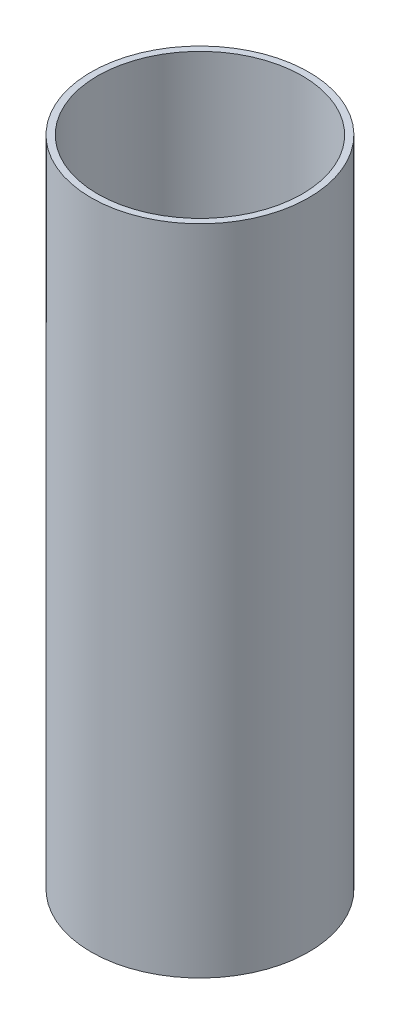
ISO-10303-21;
HEADER;
FILE_DESCRIPTION(('STEP AP214'),'2;1');
FILE_NAME('part.step','',(''),(''),'','','');
FILE_SCHEMA(('AUTOMOTIVE_DESIGN { 1 0 10303 214 1 1 1 1 }'));
ENDSEC;
DATA;
#1=APPLICATION_CONTEXT('core data for automotive mechanical design processes');
#2=APPLICATION_PROTOCOL_DEFINITION('international standard','automotive_design',2000,#1);
#3=PRODUCT_CONTEXT('',#1,'mechanical');
#4=PRODUCT('Part','Part','',(#3));
#5=PRODUCT_RELATED_PRODUCT_CATEGORY('part','',(#4));
#6=PRODUCT_DEFINITION_FORMATION('','',#4);
#7=PRODUCT_DEFINITION_CONTEXT('part definition',#1,'design');
#8=PRODUCT_DEFINITION('design','',#6,#7);
#9=PRODUCT_DEFINITION_SHAPE('','',#8);
#10=(LENGTH_UNIT() NAMED_UNIT(*) SI_UNIT(.MILLI.,.METRE.));
#11=(NAMED_UNIT(*) PLANE_ANGLE_UNIT() SI_UNIT($,.RADIAN.));
#12=(NAMED_UNIT(*) SI_UNIT($,.STERADIAN.) SOLID_ANGLE_UNIT());
#13=UNCERTAINTY_MEASURE_WITH_UNIT(LENGTH_MEASURE(1.E-05),#10,'distance_accuracy_value','');
#14=(GEOMETRIC_REPRESENTATION_CONTEXT(3) GLOBAL_UNCERTAINTY_ASSIGNED_CONTEXT((#13)) GLOBAL_UNIT_ASSIGNED_CONTEXT((#10,
#11,#12)) REPRESENTATION_CONTEXT('',''));
#15=CARTESIAN_POINT('',(0.,0.,0.));
#16=DIRECTION('',(0.,0.,1.));
#17=DIRECTION('',(1.,0.,0.));
#18=AXIS2_PLACEMENT_3D('',#15,#16,#17);
#19=CARTESIAN_POINT('',(0.,300.,0.));
#20=DIRECTION('',(0.,1.,0.));
#21=DIRECTION('',(0.,0.,1.));
#22=AXIS2_PLACEMENT_3D('',#19,#20,#21);
#23=PLANE('',#22);
#24=CARTESIAN_POINT('',(0.,300.,0.));
#25=DIRECTION('',(0.,1.,0.));
#26=DIRECTION('',(0.,0.,1.));
#27=AXIS2_PLACEMENT_3D('',#24,#25,#26);
#28=CIRCLE('',#27,50.);
#29=CARTESIAN_POINT('',(0.,300.,50.));
#30=VERTEX_POINT('',#29);
#31=EDGE_CURVE('E12',#30,#30,#28,.T.);
#32=ORIENTED_EDGE('',*,*,#31,.T.);
#33=EDGE_LOOP('',(#32));
#34=FACE_BOUND('',#33,.T.);
#35=CARTESIAN_POINT('',(0.,300.,0.));
#36=DIRECTION('',(0.,1.,0.));
#37=DIRECTION('',(0.,0.,1.));
#38=AXIS2_PLACEMENT_3D('',#35,#36,#37);
#39=CIRCLE('',#38,47.);
#40=CARTESIAN_POINT('',(0.,300.,47.));
#41=VERTEX_POINT('',#40);
#42=EDGE_CURVE('E59',#41,#41,#39,.T.);
#43=ORIENTED_EDGE('',*,*,#42,.F.);
#44=EDGE_LOOP('',(#43));
#45=FACE_BOUND('',#44,.T.);
#46=ADVANCED_FACE('F45',(#34,#45),#23,.T.);
#47=CARTESIAN_POINT('',(0.,0.,0.));
#48=DIRECTION('',(0.,1.,0.));
#49=DIRECTION('',(0.,0.,1.));
#50=AXIS2_PLACEMENT_3D('',#47,#48,#49);
#51=PLANE('',#50);
#52=CARTESIAN_POINT('',(0.,0.,0.));
#53=DIRECTION('',(0.,1.,0.));
#54=DIRECTION('',(0.,0.,1.));
#55=AXIS2_PLACEMENT_3D('',#52,#53,#54);
#56=CIRCLE('',#55,50.);
#57=CARTESIAN_POINT('',(0.,0.,50.));
#58=VERTEX_POINT('',#57);
#59=EDGE_CURVE('E49',#58,#58,#56,.T.);
#60=ORIENTED_EDGE('',*,*,#59,.F.);
#61=EDGE_LOOP('',(#60));
#62=FACE_BOUND('',#61,.T.);
#63=CARTESIAN_POINT('',(0.,0.,0.));
#64=DIRECTION('',(0.,1.,0.));
#65=DIRECTION('',(0.,0.,1.));
#66=AXIS2_PLACEMENT_3D('',#63,#64,#65);
#67=CIRCLE('',#66,47.);
#68=CARTESIAN_POINT('',(0.,0.,47.));
#69=VERTEX_POINT('',#68);
#70=EDGE_CURVE('E61',#69,#69,#67,.T.);
#71=ORIENTED_EDGE('',*,*,#70,.T.);
#72=EDGE_LOOP('',(#71));
#73=FACE_BOUND('',#72,.T.);
#74=ADVANCED_FACE('F74',(#62,#73),#51,.F.);
#75=CARTESIAN_POINT('',(0.,300.,0.));
#76=DIRECTION('',(0.,-1.,0.));
#77=DIRECTION('',(0.,0.,-1.));
#78=AXIS2_PLACEMENT_3D('',#75,#76,#77);
#79=CYLINDRICAL_SURFACE('',#78,50.);
#80=ORIENTED_EDGE('',*,*,#31,.F.);
#81=EDGE_LOOP('',(#80));
#82=FACE_BOUND('',#81,.T.);
#83=ORIENTED_EDGE('',*,*,#59,.T.);
#84=EDGE_LOOP('',(#83));
#85=FACE_BOUND('',#84,.T.);
#86=ADVANCED_FACE('F47',(#82,#85),#79,.T.);
#87=CARTESIAN_POINT('',(0.,300.,0.));
#88=DIRECTION('',(0.,-1.,0.));
#89=DIRECTION('',(0.,0.,-1.));
#90=AXIS2_PLACEMENT_3D('',#87,#88,#89);
#91=CYLINDRICAL_SURFACE('',#90,47.);
#92=ORIENTED_EDGE('',*,*,#42,.T.);
#93=EDGE_LOOP('',(#92));
#94=FACE_BOUND('',#93,.T.);
#95=ORIENTED_EDGE('',*,*,#70,.F.);
#96=EDGE_LOOP('',(#95));
#97=FACE_BOUND('',#96,.T.);
#98=ADVANCED_FACE('F70',(#94,#97),#91,.F.);
#99=CLOSED_SHELL('',(#46,#74,#86,#98));
#100=MANIFOLD_SOLID_BREP('B2',#99);
#101=ADVANCED_BREP_SHAPE_REPRESENTATION('',(#18,#100),#14);
#102=SHAPE_DEFINITION_REPRESENTATION(#9,#101);
ENDSEC;
END-ISO-10303-21;
